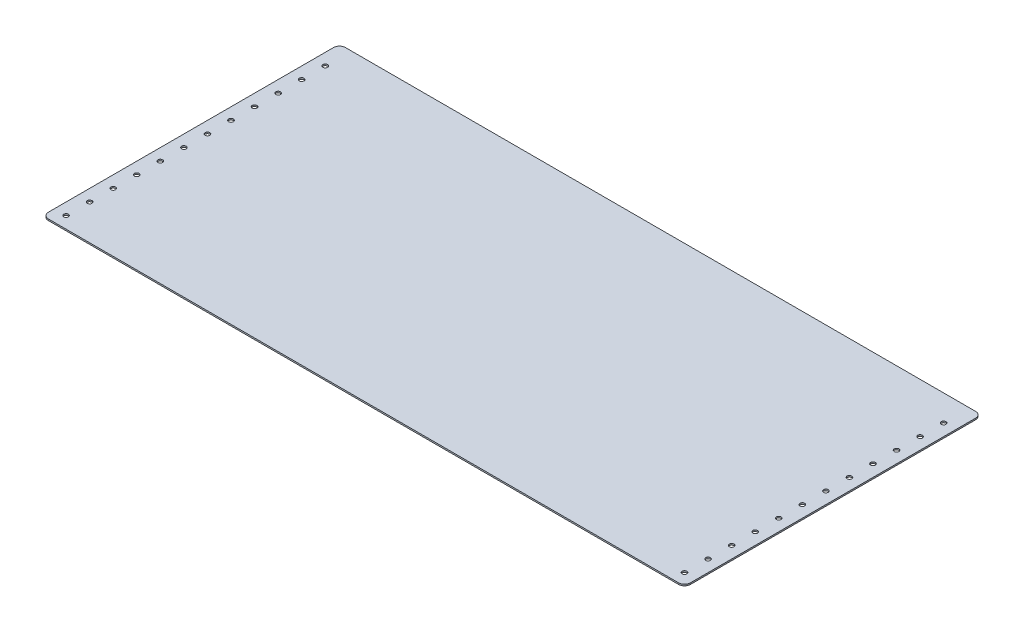
ISO-10303-21;
HEADER;
FILE_DESCRIPTION(('STEP AP214'),'2;1');
FILE_NAME('part.step','',(''),(''),'','','');
FILE_SCHEMA(('AUTOMOTIVE_DESIGN { 1 0 10303 214 1 1 1 1 }'));
ENDSEC;
DATA;
#1=APPLICATION_CONTEXT('core data for automotive mechanical design processes');
#2=APPLICATION_PROTOCOL_DEFINITION('international standard','automotive_design',2000,#1);
#3=PRODUCT_CONTEXT('',#1,'mechanical');
#4=PRODUCT('Part','Part','',(#3));
#5=PRODUCT_RELATED_PRODUCT_CATEGORY('part','',(#4));
#6=PRODUCT_DEFINITION_FORMATION('','',#4);
#7=PRODUCT_DEFINITION_CONTEXT('part definition',#1,'design');
#8=PRODUCT_DEFINITION('design','',#6,#7);
#9=PRODUCT_DEFINITION_SHAPE('','',#8);
#10=(LENGTH_UNIT() NAMED_UNIT(*) SI_UNIT(.MILLI.,.METRE.));
#11=(NAMED_UNIT(*) PLANE_ANGLE_UNIT() SI_UNIT($,.RADIAN.));
#12=(NAMED_UNIT(*) SI_UNIT($,.STERADIAN.) SOLID_ANGLE_UNIT());
#13=UNCERTAINTY_MEASURE_WITH_UNIT(LENGTH_MEASURE(1.E-05),#10,'distance_accuracy_value','');
#14=(GEOMETRIC_REPRESENTATION_CONTEXT(3) GLOBAL_UNCERTAINTY_ASSIGNED_CONTEXT((#13)) GLOBAL_UNIT_ASSIGNED_CONTEXT((#10,
#11,#12)) REPRESENTATION_CONTEXT('',''));
#15=CARTESIAN_POINT('',(0.,0.,0.));
#16=DIRECTION('',(0.,0.,1.));
#17=DIRECTION('',(1.,0.,0.));
#18=AXIS2_PLACEMENT_3D('',#15,#16,#17);
#19=CARTESIAN_POINT('',(0.,-639.7625,558.8));
#20=DIRECTION('',(0.,0.,-1.));
#21=DIRECTION('',(-1.,0.,0.));
#22=AXIS2_PLACEMENT_3D('',#19,#20,#21);
#23=PLANE('',#22);
#24=DIRECTION('',(1.,0.,0.));
#25=VECTOR('',#24,1.);
#26=CARTESIAN_POINT('',(0.,-639.7625,558.8));
#27=LINE('',#26,#25);
#28=CARTESIAN_POINT('',(-339.725,-639.7625,558.8));
#29=VERTEX_POINT('',#28);
#30=CARTESIAN_POINT('',(339.725,-639.7625,558.8));
#31=VERTEX_POINT('',#30);
#32=EDGE_CURVE('E140',#29,#31,#27,.T.);
#33=ORIENTED_EDGE('',*,*,#32,.F.);
#34=DIRECTION('',(0.,-1.,0.));
#35=VECTOR('',#34,1.);
#36=CARTESIAN_POINT('',(-339.725,-641.35,558.8));
#37=LINE('',#36,#35);
#38=CARTESIAN_POINT('',(-339.725,-641.35,558.8));
#39=VERTEX_POINT('',#38);
#40=EDGE_CURVE('E133',#29,#39,#37,.T.);
#41=ORIENTED_EDGE('',*,*,#40,.T.);
#42=DIRECTION('',(1.,0.,0.));
#43=VECTOR('',#42,1.);
#44=CARTESIAN_POINT('',(0.,-641.35,558.8));
#45=LINE('',#44,#43);
#46=CARTESIAN_POINT('',(339.725,-641.35,558.8));
#47=VERTEX_POINT('',#46);
#48=EDGE_CURVE('E139',#39,#47,#45,.T.);
#49=ORIENTED_EDGE('',*,*,#48,.T.);
#50=DIRECTION('',(0.,-1.,0.));
#51=VECTOR('',#50,1.);
#52=CARTESIAN_POINT('',(339.725,-639.7625,558.8));
#53=LINE('',#52,#51);
#54=EDGE_CURVE('E128',#47,#31,#53,.F.);
#55=ORIENTED_EDGE('',*,*,#54,.T.);
#56=EDGE_LOOP('',(#33,#41,#49,#55));
#57=FACE_BOUND('',#56,.T.);
#58=ADVANCED_FACE('F17',(#57),#23,.F.);
#59=CARTESIAN_POINT('',(-346.075,-639.7625,398.718559901171));
#60=DIRECTION('',(-1.,0.,0.));
#61=DIRECTION('',(0.,-1.,0.));
#62=AXIS2_PLACEMENT_3D('',#59,#60,#61);
#63=PLANE('',#62);
#64=DIRECTION('',(0.,0.,-1.));
#65=VECTOR('',#64,1.);
#66=CARTESIAN_POINT('',(-346.075,-641.35,398.718559901171));
#67=LINE('',#66,#65);
#68=CARTESIAN_POINT('',(-346.075,-641.35,552.45));
#69=VERTEX_POINT('',#68);
#70=CARTESIAN_POINT('',(-346.075,-641.35,244.987119802341));
#71=VERTEX_POINT('',#70);
#72=EDGE_CURVE('E91',#69,#71,#67,.T.);
#73=ORIENTED_EDGE('',*,*,#72,.F.);
#74=DIRECTION('',(0.,-1.,0.));
#75=VECTOR('',#74,1.);
#76=CARTESIAN_POINT('',(-346.075,-639.7625,552.45));
#77=LINE('',#76,#75);
#78=CARTESIAN_POINT('',(-346.075,-639.7625,552.45));
#79=VERTEX_POINT('',#78);
#80=EDGE_CURVE('E25',#69,#79,#77,.F.);
#81=ORIENTED_EDGE('',*,*,#80,.T.);
#82=DIRECTION('',(0.,0.,-1.));
#83=VECTOR('',#82,1.);
#84=CARTESIAN_POINT('',(-346.075,-639.7625,398.718559901171));
#85=LINE('',#84,#83);
#86=CARTESIAN_POINT('',(-346.075,-639.7625,244.987119802341));
#87=VERTEX_POINT('',#86);
#88=EDGE_CURVE('E220',#79,#87,#85,.T.);
#89=ORIENTED_EDGE('',*,*,#88,.T.);
#90=DIRECTION('',(0.,-1.,0.));
#91=VECTOR('',#90,1.);
#92=CARTESIAN_POINT('',(-346.075,-639.7625,244.987119802341));
#93=LINE('',#92,#91);
#94=EDGE_CURVE('E113',#87,#71,#93,.T.);
#95=ORIENTED_EDGE('',*,*,#94,.T.);
#96=EDGE_LOOP('',(#73,#81,#89,#95));
#97=FACE_BOUND('',#96,.T.);
#98=ADVANCED_FACE('F312',(#97),#63,.T.);
#99=CARTESIAN_POINT('',(0.,-639.7625,238.637119802341));
#100=DIRECTION('',(0.,0.,-1.));
#101=DIRECTION('',(-1.,0.,0.));
#102=AXIS2_PLACEMENT_3D('',#99,#100,#101);
#103=PLANE('',#102);
#104=DIRECTION('',(1.,0.,0.));
#105=VECTOR('',#104,1.);
#106=CARTESIAN_POINT('',(0.,-641.35,238.637119802341));
#107=LINE('',#106,#105);
#108=CARTESIAN_POINT('',(-339.725,-641.35,238.637119802341));
#109=VERTEX_POINT('',#108);
#110=CARTESIAN_POINT('',(339.725,-641.35,238.637119802341));
#111=VERTEX_POINT('',#110);
#112=EDGE_CURVE('E79',#109,#111,#107,.T.);
#113=ORIENTED_EDGE('',*,*,#112,.F.);
#114=DIRECTION('',(0.,-1.,0.));
#115=VECTOR('',#114,1.);
#116=CARTESIAN_POINT('',(-339.725,-639.7625,238.637119802341));
#117=LINE('',#116,#115);
#118=CARTESIAN_POINT('',(-339.725,-639.7625,238.637119802341));
#119=VERTEX_POINT('',#118);
#120=EDGE_CURVE('E117',#109,#119,#117,.F.);
#121=ORIENTED_EDGE('',*,*,#120,.T.);
#122=DIRECTION('',(1.,0.,0.));
#123=VECTOR('',#122,1.);
#124=CARTESIAN_POINT('',(0.,-639.7625,238.637119802341));
#125=LINE('',#124,#123);
#126=CARTESIAN_POINT('',(339.725,-639.7625,238.637119802341));
#127=VERTEX_POINT('',#126);
#128=EDGE_CURVE('E103',#119,#127,#125,.T.);
#129=ORIENTED_EDGE('',*,*,#128,.T.);
#130=DIRECTION('',(0.,-1.,0.));
#131=VECTOR('',#130,1.);
#132=CARTESIAN_POINT('',(339.725,-641.35,238.637119802341));
#133=LINE('',#132,#131);
#134=EDGE_CURVE('E97',#127,#111,#133,.T.);
#135=ORIENTED_EDGE('',*,*,#134,.T.);
#136=EDGE_LOOP('',(#113,#121,#129,#135));
#137=FACE_BOUND('',#136,.T.);
#138=ADVANCED_FACE('F101',(#137),#103,.T.);
#139=CARTESIAN_POINT('',(-333.375,-639.7625,546.1));
#140=DIRECTION('',(0.,-1.,0.));
#141=DIRECTION('',(1.,0.,0.));
#142=AXIS2_PLACEMENT_3D('',#139,#140,#141);
#143=CYLINDRICAL_SURFACE('',#142,2.5527);
#144=CARTESIAN_POINT('',(-333.375,-639.7625,546.1));
#145=DIRECTION('',(0.,-1.,0.));
#146=DIRECTION('',(1.,0.,0.));
#147=AXIS2_PLACEMENT_3D('',#144,#145,#146);
#148=CIRCLE('',#147,2.5527);
#149=CARTESIAN_POINT('',(-330.8223,-639.7625,546.1));
#150=VERTEX_POINT('',#149);
#151=EDGE_CURVE('E223',#150,#150,#148,.T.);
#152=ORIENTED_EDGE('',*,*,#151,.F.);
#153=EDGE_LOOP('',(#152));
#154=FACE_BOUND('',#153,.T.);
#155=CARTESIAN_POINT('',(-333.375,-641.35,546.1));
#156=DIRECTION('',(0.,-1.,0.));
#157=DIRECTION('',(1.,0.,0.));
#158=AXIS2_PLACEMENT_3D('',#155,#156,#157);
#159=CIRCLE('',#158,2.5527);
#160=CARTESIAN_POINT('',(-330.8223,-641.35,546.1));
#161=VERTEX_POINT('',#160);
#162=EDGE_CURVE('E144',#161,#161,#159,.T.);
#163=ORIENTED_EDGE('',*,*,#162,.T.);
#164=EDGE_LOOP('',(#163));
#165=FACE_BOUND('',#164,.T.);
#166=ADVANCED_FACE('F320',(#154,#165),#143,.F.);
#167=CARTESIAN_POINT('',(333.375,-639.7625,520.7));
#168=DIRECTION('',(0.,-1.,0.));
#169=DIRECTION('',(1.,0.,0.));
#170=AXIS2_PLACEMENT_3D('',#167,#168,#169);
#171=CYLINDRICAL_SURFACE('',#170,2.5527);
#172=CARTESIAN_POINT('',(333.375,-639.7625,520.7));
#173=DIRECTION('',(0.,1.,0.));
#174=DIRECTION('',(1.,0.,0.));
#175=AXIS2_PLACEMENT_3D('',#172,#173,#174);
#176=CIRCLE('',#175,2.5527);
#177=CARTESIAN_POINT('',(335.9277,-639.7625,520.7));
#178=VERTEX_POINT('',#177);
#179=EDGE_CURVE('E226',#178,#178,#176,.T.);
#180=ORIENTED_EDGE('',*,*,#179,.T.);
#181=EDGE_LOOP('',(#180));
#182=FACE_BOUND('',#181,.T.);
#183=CARTESIAN_POINT('',(333.375,-641.35,520.7));
#184=DIRECTION('',(0.,1.,0.));
#185=DIRECTION('',(1.,0.,0.));
#186=AXIS2_PLACEMENT_3D('',#183,#184,#185);
#187=CIRCLE('',#186,2.5527);
#188=CARTESIAN_POINT('',(335.9277,-641.35,520.7));
#189=VERTEX_POINT('',#188);
#190=EDGE_CURVE('E148',#189,#189,#187,.T.);
#191=ORIENTED_EDGE('',*,*,#190,.F.);
#192=EDGE_LOOP('',(#191));
#193=FACE_BOUND('',#192,.T.);
#194=ADVANCED_FACE('F323',(#182,#193),#171,.F.);
#195=CARTESIAN_POINT('',(-333.375,-639.7625,495.3));
#196=DIRECTION('',(0.,-1.,0.));
#197=DIRECTION('',(1.,0.,0.));
#198=AXIS2_PLACEMENT_3D('',#195,#196,#197);
#199=CYLINDRICAL_SURFACE('',#198,2.5527);
#200=CARTESIAN_POINT('',(-333.375,-639.7625,495.3));
#201=DIRECTION('',(0.,-1.,0.));
#202=DIRECTION('',(1.,0.,0.));
#203=AXIS2_PLACEMENT_3D('',#200,#201,#202);
#204=CIRCLE('',#203,2.5527);
#205=CARTESIAN_POINT('',(-330.8223,-639.7625,495.3));
#206=VERTEX_POINT('',#205);
#207=EDGE_CURVE('E229',#206,#206,#204,.T.);
#208=ORIENTED_EDGE('',*,*,#207,.F.);
#209=EDGE_LOOP('',(#208));
#210=FACE_BOUND('',#209,.T.);
#211=CARTESIAN_POINT('',(-333.375,-641.35,495.3));
#212=DIRECTION('',(0.,-1.,0.));
#213=DIRECTION('',(1.,0.,0.));
#214=AXIS2_PLACEMENT_3D('',#211,#212,#213);
#215=CIRCLE('',#214,2.5527);
#216=CARTESIAN_POINT('',(-330.8223,-641.35,495.3));
#217=VERTEX_POINT('',#216);
#218=EDGE_CURVE('E153',#217,#217,#215,.T.);
#219=ORIENTED_EDGE('',*,*,#218,.T.);
#220=EDGE_LOOP('',(#219));
#221=FACE_BOUND('',#220,.T.);
#222=ADVANCED_FACE('F327',(#210,#221),#199,.F.);
#223=CARTESIAN_POINT('',(333.375,-639.7625,469.9));
#224=DIRECTION('',(0.,-1.,0.));
#225=DIRECTION('',(1.,0.,0.));
#226=AXIS2_PLACEMENT_3D('',#223,#224,#225);
#227=CYLINDRICAL_SURFACE('',#226,2.5527);
#228=CARTESIAN_POINT('',(333.375,-639.7625,469.9));
#229=DIRECTION('',(0.,1.,0.));
#230=DIRECTION('',(1.,0.,0.));
#231=AXIS2_PLACEMENT_3D('',#228,#229,#230);
#232=CIRCLE('',#231,2.5527);
#233=CARTESIAN_POINT('',(335.9277,-639.7625,469.9));
#234=VERTEX_POINT('',#233);
#235=EDGE_CURVE('E232',#234,#234,#232,.T.);
#236=ORIENTED_EDGE('',*,*,#235,.T.);
#237=EDGE_LOOP('',(#236));
#238=FACE_BOUND('',#237,.T.);
#239=CARTESIAN_POINT('',(333.375,-641.35,469.9));
#240=DIRECTION('',(0.,1.,0.));
#241=DIRECTION('',(1.,0.,0.));
#242=AXIS2_PLACEMENT_3D('',#239,#240,#241);
#243=CIRCLE('',#242,2.5527);
#244=CARTESIAN_POINT('',(335.9277,-641.35,469.9));
#245=VERTEX_POINT('',#244);
#246=EDGE_CURVE('E156',#245,#245,#243,.T.);
#247=ORIENTED_EDGE('',*,*,#246,.F.);
#248=EDGE_LOOP('',(#247));
#249=FACE_BOUND('',#248,.T.);
#250=ADVANCED_FACE('F331',(#238,#249),#227,.F.);
#251=CARTESIAN_POINT('',(-333.375,-639.7625,444.5));
#252=DIRECTION('',(0.,-1.,0.));
#253=DIRECTION('',(1.,0.,0.));
#254=AXIS2_PLACEMENT_3D('',#251,#252,#253);
#255=CYLINDRICAL_SURFACE('',#254,2.5527);
#256=CARTESIAN_POINT('',(-333.375,-639.7625,444.5));
#257=DIRECTION('',(0.,-1.,0.));
#258=DIRECTION('',(1.,0.,0.));
#259=AXIS2_PLACEMENT_3D('',#256,#257,#258);
#260=CIRCLE('',#259,2.5527);
#261=CARTESIAN_POINT('',(-330.8223,-639.7625,444.5));
#262=VERTEX_POINT('',#261);
#263=EDGE_CURVE('E235',#262,#262,#260,.T.);
#264=ORIENTED_EDGE('',*,*,#263,.F.);
#265=EDGE_LOOP('',(#264));
#266=FACE_BOUND('',#265,.T.);
#267=CARTESIAN_POINT('',(-333.375,-641.35,444.5));
#268=DIRECTION('',(0.,-1.,0.));
#269=DIRECTION('',(1.,0.,0.));
#270=AXIS2_PLACEMENT_3D('',#267,#268,#269);
#271=CIRCLE('',#270,2.5527);
#272=CARTESIAN_POINT('',(-330.8223,-641.35,444.5));
#273=VERTEX_POINT('',#272);
#274=EDGE_CURVE('E159',#273,#273,#271,.T.);
#275=ORIENTED_EDGE('',*,*,#274,.T.);
#276=EDGE_LOOP('',(#275));
#277=FACE_BOUND('',#276,.T.);
#278=ADVANCED_FACE('F335',(#266,#277),#255,.F.);
#279=CARTESIAN_POINT('',(333.375,-639.7625,419.1));
#280=DIRECTION('',(0.,-1.,0.));
#281=DIRECTION('',(1.,0.,0.));
#282=AXIS2_PLACEMENT_3D('',#279,#280,#281);
#283=CYLINDRICAL_SURFACE('',#282,2.5527);
#284=CARTESIAN_POINT('',(333.375,-639.7625,419.1));
#285=DIRECTION('',(0.,1.,0.));
#286=DIRECTION('',(1.,0.,0.));
#287=AXIS2_PLACEMENT_3D('',#284,#285,#286);
#288=CIRCLE('',#287,2.5527);
#289=CARTESIAN_POINT('',(335.9277,-639.7625,419.1));
#290=VERTEX_POINT('',#289);
#291=EDGE_CURVE('E238',#290,#290,#288,.T.);
#292=ORIENTED_EDGE('',*,*,#291,.T.);
#293=EDGE_LOOP('',(#292));
#294=FACE_BOUND('',#293,.T.);
#295=CARTESIAN_POINT('',(333.375,-641.35,419.1));
#296=DIRECTION('',(0.,1.,0.));
#297=DIRECTION('',(1.,0.,0.));
#298=AXIS2_PLACEMENT_3D('',#295,#296,#297);
#299=CIRCLE('',#298,2.5527);
#300=CARTESIAN_POINT('',(335.9277,-641.35,419.1));
#301=VERTEX_POINT('',#300);
#302=EDGE_CURVE('E162',#301,#301,#299,.T.);
#303=ORIENTED_EDGE('',*,*,#302,.F.);
#304=EDGE_LOOP('',(#303));
#305=FACE_BOUND('',#304,.T.);
#306=ADVANCED_FACE('F339',(#294,#305),#283,.F.);
#307=CARTESIAN_POINT('',(-333.375,-639.7625,393.7));
#308=DIRECTION('',(0.,-1.,0.));
#309=DIRECTION('',(1.,0.,0.));
#310=AXIS2_PLACEMENT_3D('',#307,#308,#309);
#311=CYLINDRICAL_SURFACE('',#310,2.5527);
#312=CARTESIAN_POINT('',(-333.375,-639.7625,393.7));
#313=DIRECTION('',(0.,-1.,0.));
#314=DIRECTION('',(1.,0.,0.));
#315=AXIS2_PLACEMENT_3D('',#312,#313,#314);
#316=CIRCLE('',#315,2.5527);
#317=CARTESIAN_POINT('',(-330.8223,-639.7625,393.7));
#318=VERTEX_POINT('',#317);
#319=EDGE_CURVE('E241',#318,#318,#316,.T.);
#320=ORIENTED_EDGE('',*,*,#319,.F.);
#321=EDGE_LOOP('',(#320));
#322=FACE_BOUND('',#321,.T.);
#323=CARTESIAN_POINT('',(-333.375,-641.35,393.7));
#324=DIRECTION('',(0.,-1.,0.));
#325=DIRECTION('',(1.,0.,0.));
#326=AXIS2_PLACEMENT_3D('',#323,#324,#325);
#327=CIRCLE('',#326,2.5527);
#328=CARTESIAN_POINT('',(-330.8223,-641.35,393.7));
#329=VERTEX_POINT('',#328);
#330=EDGE_CURVE('E165',#329,#329,#327,.T.);
#331=ORIENTED_EDGE('',*,*,#330,.T.);
#332=EDGE_LOOP('',(#331));
#333=FACE_BOUND('',#332,.T.);
#334=ADVANCED_FACE('F343',(#322,#333),#311,.F.);
#335=CARTESIAN_POINT('',(333.375,-639.7625,368.3));
#336=DIRECTION('',(0.,-1.,0.));
#337=DIRECTION('',(1.,0.,0.));
#338=AXIS2_PLACEMENT_3D('',#335,#336,#337);
#339=CYLINDRICAL_SURFACE('',#338,2.5527);
#340=CARTESIAN_POINT('',(333.375,-639.7625,368.3));
#341=DIRECTION('',(0.,1.,0.));
#342=DIRECTION('',(1.,0.,0.));
#343=AXIS2_PLACEMENT_3D('',#340,#341,#342);
#344=CIRCLE('',#343,2.5527);
#345=CARTESIAN_POINT('',(335.9277,-639.7625,368.3));
#346=VERTEX_POINT('',#345);
#347=EDGE_CURVE('E244',#346,#346,#344,.T.);
#348=ORIENTED_EDGE('',*,*,#347,.T.);
#349=EDGE_LOOP('',(#348));
#350=FACE_BOUND('',#349,.T.);
#351=CARTESIAN_POINT('',(333.375,-641.35,368.3));
#352=DIRECTION('',(0.,1.,0.));
#353=DIRECTION('',(1.,0.,0.));
#354=AXIS2_PLACEMENT_3D('',#351,#352,#353);
#355=CIRCLE('',#354,2.5527);
#356=CARTESIAN_POINT('',(335.9277,-641.35,368.3));
#357=VERTEX_POINT('',#356);
#358=EDGE_CURVE('E168',#357,#357,#355,.T.);
#359=ORIENTED_EDGE('',*,*,#358,.F.);
#360=EDGE_LOOP('',(#359));
#361=FACE_BOUND('',#360,.T.);
#362=ADVANCED_FACE('F347',(#350,#361),#339,.F.);
#363=CARTESIAN_POINT('',(-333.375,-639.7625,342.9));
#364=DIRECTION('',(0.,-1.,0.));
#365=DIRECTION('',(1.,0.,0.));
#366=AXIS2_PLACEMENT_3D('',#363,#364,#365);
#367=CYLINDRICAL_SURFACE('',#366,2.5527);
#368=CARTESIAN_POINT('',(-333.375,-639.7625,342.9));
#369=DIRECTION('',(0.,-1.,0.));
#370=DIRECTION('',(1.,0.,0.));
#371=AXIS2_PLACEMENT_3D('',#368,#369,#370);
#372=CIRCLE('',#371,2.5527);
#373=CARTESIAN_POINT('',(-330.8223,-639.7625,342.9));
#374=VERTEX_POINT('',#373);
#375=EDGE_CURVE('E247',#374,#374,#372,.T.);
#376=ORIENTED_EDGE('',*,*,#375,.F.);
#377=EDGE_LOOP('',(#376));
#378=FACE_BOUND('',#377,.T.);
#379=CARTESIAN_POINT('',(-333.375,-641.35,342.9));
#380=DIRECTION('',(0.,-1.,0.));
#381=DIRECTION('',(1.,0.,0.));
#382=AXIS2_PLACEMENT_3D('',#379,#380,#381);
#383=CIRCLE('',#382,2.5527);
#384=CARTESIAN_POINT('',(-330.8223,-641.35,342.9));
#385=VERTEX_POINT('',#384);
#386=EDGE_CURVE('E171',#385,#385,#383,.T.);
#387=ORIENTED_EDGE('',*,*,#386,.T.);
#388=EDGE_LOOP('',(#387));
#389=FACE_BOUND('',#388,.T.);
#390=ADVANCED_FACE('F351',(#378,#389),#367,.F.);
#391=CARTESIAN_POINT('',(333.375,-639.7625,317.5));
#392=DIRECTION('',(0.,-1.,0.));
#393=DIRECTION('',(1.,0.,0.));
#394=AXIS2_PLACEMENT_3D('',#391,#392,#393);
#395=CYLINDRICAL_SURFACE('',#394,2.5527);
#396=CARTESIAN_POINT('',(333.375,-639.7625,317.5));
#397=DIRECTION('',(0.,1.,0.));
#398=DIRECTION('',(1.,0.,0.));
#399=AXIS2_PLACEMENT_3D('',#396,#397,#398);
#400=CIRCLE('',#399,2.5527);
#401=CARTESIAN_POINT('',(335.9277,-639.7625,317.5));
#402=VERTEX_POINT('',#401);
#403=EDGE_CURVE('E250',#402,#402,#400,.T.);
#404=ORIENTED_EDGE('',*,*,#403,.T.);
#405=EDGE_LOOP('',(#404));
#406=FACE_BOUND('',#405,.T.);
#407=CARTESIAN_POINT('',(333.375,-641.35,317.5));
#408=DIRECTION('',(0.,1.,0.));
#409=DIRECTION('',(1.,0.,0.));
#410=AXIS2_PLACEMENT_3D('',#407,#408,#409);
#411=CIRCLE('',#410,2.5527);
#412=CARTESIAN_POINT('',(335.9277,-641.35,317.5));
#413=VERTEX_POINT('',#412);
#414=EDGE_CURVE('E174',#413,#413,#411,.T.);
#415=ORIENTED_EDGE('',*,*,#414,.F.);
#416=EDGE_LOOP('',(#415));
#417=FACE_BOUND('',#416,.T.);
#418=ADVANCED_FACE('F355',(#406,#417),#395,.F.);
#419=CARTESIAN_POINT('',(-333.375,-639.7625,292.1));
#420=DIRECTION('',(0.,-1.,0.));
#421=DIRECTION('',(1.,0.,0.));
#422=AXIS2_PLACEMENT_3D('',#419,#420,#421);
#423=CYLINDRICAL_SURFACE('',#422,2.5527);
#424=CARTESIAN_POINT('',(-333.375,-639.7625,292.1));
#425=DIRECTION('',(0.,-1.,0.));
#426=DIRECTION('',(1.,0.,0.));
#427=AXIS2_PLACEMENT_3D('',#424,#425,#426);
#428=CIRCLE('',#427,2.5527);
#429=CARTESIAN_POINT('',(-330.8223,-639.7625,292.1));
#430=VERTEX_POINT('',#429);
#431=EDGE_CURVE('E253',#430,#430,#428,.T.);
#432=ORIENTED_EDGE('',*,*,#431,.F.);
#433=EDGE_LOOP('',(#432));
#434=FACE_BOUND('',#433,.T.);
#435=CARTESIAN_POINT('',(-333.375,-641.35,292.1));
#436=DIRECTION('',(0.,-1.,0.));
#437=DIRECTION('',(1.,0.,0.));
#438=AXIS2_PLACEMENT_3D('',#435,#436,#437);
#439=CIRCLE('',#438,2.5527);
#440=CARTESIAN_POINT('',(-330.8223,-641.35,292.1));
#441=VERTEX_POINT('',#440);
#442=EDGE_CURVE('E177',#441,#441,#439,.T.);
#443=ORIENTED_EDGE('',*,*,#442,.T.);
#444=EDGE_LOOP('',(#443));
#445=FACE_BOUND('',#444,.T.);
#446=ADVANCED_FACE('F359',(#434,#445),#423,.F.);
#447=CARTESIAN_POINT('',(333.375,-639.7625,266.7));
#448=DIRECTION('',(0.,-1.,0.));
#449=DIRECTION('',(1.,0.,0.));
#450=AXIS2_PLACEMENT_3D('',#447,#448,#449);
#451=CYLINDRICAL_SURFACE('',#450,2.5527);
#452=CARTESIAN_POINT('',(333.375,-639.7625,266.7));
#453=DIRECTION('',(0.,1.,0.));
#454=DIRECTION('',(1.,0.,0.));
#455=AXIS2_PLACEMENT_3D('',#452,#453,#454);
#456=CIRCLE('',#455,2.5527);
#457=CARTESIAN_POINT('',(335.9277,-639.7625,266.7));
#458=VERTEX_POINT('',#457);
#459=EDGE_CURVE('E256',#458,#458,#456,.T.);
#460=ORIENTED_EDGE('',*,*,#459,.T.);
#461=EDGE_LOOP('',(#460));
#462=FACE_BOUND('',#461,.T.);
#463=CARTESIAN_POINT('',(333.375,-641.35,266.7));
#464=DIRECTION('',(0.,1.,0.));
#465=DIRECTION('',(1.,0.,0.));
#466=AXIS2_PLACEMENT_3D('',#463,#464,#465);
#467=CIRCLE('',#466,2.5527);
#468=CARTESIAN_POINT('',(335.9277,-641.35,266.7));
#469=VERTEX_POINT('',#468);
#470=EDGE_CURVE('E180',#469,#469,#467,.T.);
#471=ORIENTED_EDGE('',*,*,#470,.F.);
#472=EDGE_LOOP('',(#471));
#473=FACE_BOUND('',#472,.T.);
#474=ADVANCED_FACE('F363',(#462,#473),#451,.F.);
#475=CARTESIAN_POINT('',(-333.375,-639.7625,266.7));
#476=DIRECTION('',(0.,-1.,0.));
#477=DIRECTION('',(1.,0.,0.));
#478=AXIS2_PLACEMENT_3D('',#475,#476,#477);
#479=CYLINDRICAL_SURFACE('',#478,2.5527);
#480=CARTESIAN_POINT('',(-333.375,-639.7625,266.7));
#481=DIRECTION('',(0.,-1.,0.));
#482=DIRECTION('',(1.,0.,0.));
#483=AXIS2_PLACEMENT_3D('',#480,#481,#482);
#484=CIRCLE('',#483,2.5527);
#485=CARTESIAN_POINT('',(-330.8223,-639.7625,266.7));
#486=VERTEX_POINT('',#485);
#487=EDGE_CURVE('E259',#486,#486,#484,.T.);
#488=ORIENTED_EDGE('',*,*,#487,.F.);
#489=EDGE_LOOP('',(#488));
#490=FACE_BOUND('',#489,.T.);
#491=CARTESIAN_POINT('',(-333.375,-641.35,266.7));
#492=DIRECTION('',(0.,-1.,0.));
#493=DIRECTION('',(1.,0.,0.));
#494=AXIS2_PLACEMENT_3D('',#491,#492,#493);
#495=CIRCLE('',#494,2.5527);
#496=CARTESIAN_POINT('',(-330.8223,-641.35,266.7));
#497=VERTEX_POINT('',#496);
#498=EDGE_CURVE('E183',#497,#497,#495,.T.);
#499=ORIENTED_EDGE('',*,*,#498,.T.);
#500=EDGE_LOOP('',(#499));
#501=FACE_BOUND('',#500,.T.);
#502=ADVANCED_FACE('F367',(#490,#501),#479,.F.);
#503=CARTESIAN_POINT('',(333.375,-639.7625,292.1));
#504=DIRECTION('',(0.,-1.,0.));
#505=DIRECTION('',(1.,0.,0.));
#506=AXIS2_PLACEMENT_3D('',#503,#504,#505);
#507=CYLINDRICAL_SURFACE('',#506,2.5527);
#508=CARTESIAN_POINT('',(333.375,-639.7625,292.1));
#509=DIRECTION('',(0.,1.,0.));
#510=DIRECTION('',(1.,0.,0.));
#511=AXIS2_PLACEMENT_3D('',#508,#509,#510);
#512=CIRCLE('',#511,2.5527);
#513=CARTESIAN_POINT('',(335.9277,-639.7625,292.1));
#514=VERTEX_POINT('',#513);
#515=EDGE_CURVE('E262',#514,#514,#512,.T.);
#516=ORIENTED_EDGE('',*,*,#515,.T.);
#517=EDGE_LOOP('',(#516));
#518=FACE_BOUND('',#517,.T.);
#519=CARTESIAN_POINT('',(333.375,-641.35,292.1));
#520=DIRECTION('',(0.,1.,0.));
#521=DIRECTION('',(1.,0.,0.));
#522=AXIS2_PLACEMENT_3D('',#519,#520,#521);
#523=CIRCLE('',#522,2.5527);
#524=CARTESIAN_POINT('',(335.9277,-641.35,292.1));
#525=VERTEX_POINT('',#524);
#526=EDGE_CURVE('E186',#525,#525,#523,.T.);
#527=ORIENTED_EDGE('',*,*,#526,.F.);
#528=EDGE_LOOP('',(#527));
#529=FACE_BOUND('',#528,.T.);
#530=ADVANCED_FACE('F371',(#518,#529),#507,.F.);
#531=CARTESIAN_POINT('',(-333.375,-639.7625,317.5));
#532=DIRECTION('',(0.,-1.,0.));
#533=DIRECTION('',(1.,0.,0.));
#534=AXIS2_PLACEMENT_3D('',#531,#532,#533);
#535=CYLINDRICAL_SURFACE('',#534,2.5527);
#536=CARTESIAN_POINT('',(-333.375,-639.7625,317.5));
#537=DIRECTION('',(0.,-1.,0.));
#538=DIRECTION('',(1.,0.,0.));
#539=AXIS2_PLACEMENT_3D('',#536,#537,#538);
#540=CIRCLE('',#539,2.5527);
#541=CARTESIAN_POINT('',(-330.8223,-639.7625,317.5));
#542=VERTEX_POINT('',#541);
#543=EDGE_CURVE('E265',#542,#542,#540,.T.);
#544=ORIENTED_EDGE('',*,*,#543,.F.);
#545=EDGE_LOOP('',(#544));
#546=FACE_BOUND('',#545,.T.);
#547=CARTESIAN_POINT('',(-333.375,-641.35,317.5));
#548=DIRECTION('',(0.,-1.,0.));
#549=DIRECTION('',(1.,0.,0.));
#550=AXIS2_PLACEMENT_3D('',#547,#548,#549);
#551=CIRCLE('',#550,2.5527);
#552=CARTESIAN_POINT('',(-330.8223,-641.35,317.5));
#553=VERTEX_POINT('',#552);
#554=EDGE_CURVE('E189',#553,#553,#551,.T.);
#555=ORIENTED_EDGE('',*,*,#554,.T.);
#556=EDGE_LOOP('',(#555));
#557=FACE_BOUND('',#556,.T.);
#558=ADVANCED_FACE('F375',(#546,#557),#535,.F.);
#559=CARTESIAN_POINT('',(333.375,-639.7625,342.9));
#560=DIRECTION('',(0.,-1.,0.));
#561=DIRECTION('',(1.,0.,0.));
#562=AXIS2_PLACEMENT_3D('',#559,#560,#561);
#563=CYLINDRICAL_SURFACE('',#562,2.5527);
#564=CARTESIAN_POINT('',(333.375,-639.7625,342.9));
#565=DIRECTION('',(0.,1.,0.));
#566=DIRECTION('',(1.,0.,0.));
#567=AXIS2_PLACEMENT_3D('',#564,#565,#566);
#568=CIRCLE('',#567,2.5527);
#569=CARTESIAN_POINT('',(335.9277,-639.7625,342.9));
#570=VERTEX_POINT('',#569);
#571=EDGE_CURVE('E268',#570,#570,#568,.T.);
#572=ORIENTED_EDGE('',*,*,#571,.T.);
#573=EDGE_LOOP('',(#572));
#574=FACE_BOUND('',#573,.T.);
#575=CARTESIAN_POINT('',(333.375,-641.35,342.9));
#576=DIRECTION('',(0.,1.,0.));
#577=DIRECTION('',(1.,0.,0.));
#578=AXIS2_PLACEMENT_3D('',#575,#576,#577);
#579=CIRCLE('',#578,2.5527);
#580=CARTESIAN_POINT('',(335.9277,-641.35,342.9));
#581=VERTEX_POINT('',#580);
#582=EDGE_CURVE('E192',#581,#581,#579,.T.);
#583=ORIENTED_EDGE('',*,*,#582,.F.);
#584=EDGE_LOOP('',(#583));
#585=FACE_BOUND('',#584,.T.);
#586=ADVANCED_FACE('F379',(#574,#585),#563,.F.);
#587=CARTESIAN_POINT('',(-333.375,-639.7625,368.3));
#588=DIRECTION('',(0.,-1.,0.));
#589=DIRECTION('',(1.,0.,0.));
#590=AXIS2_PLACEMENT_3D('',#587,#588,#589);
#591=CYLINDRICAL_SURFACE('',#590,2.5527);
#592=CARTESIAN_POINT('',(-333.375,-639.7625,368.3));
#593=DIRECTION('',(0.,-1.,0.));
#594=DIRECTION('',(1.,0.,0.));
#595=AXIS2_PLACEMENT_3D('',#592,#593,#594);
#596=CIRCLE('',#595,2.5527);
#597=CARTESIAN_POINT('',(-330.8223,-639.7625,368.3));
#598=VERTEX_POINT('',#597);
#599=EDGE_CURVE('E271',#598,#598,#596,.T.);
#600=ORIENTED_EDGE('',*,*,#599,.F.);
#601=EDGE_LOOP('',(#600));
#602=FACE_BOUND('',#601,.T.);
#603=CARTESIAN_POINT('',(-333.375,-641.35,368.3));
#604=DIRECTION('',(0.,-1.,0.));
#605=DIRECTION('',(1.,0.,0.));
#606=AXIS2_PLACEMENT_3D('',#603,#604,#605);
#607=CIRCLE('',#606,2.5527);
#608=CARTESIAN_POINT('',(-330.8223,-641.35,368.3));
#609=VERTEX_POINT('',#608);
#610=EDGE_CURVE('E195',#609,#609,#607,.T.);
#611=ORIENTED_EDGE('',*,*,#610,.T.);
#612=EDGE_LOOP('',(#611));
#613=FACE_BOUND('',#612,.T.);
#614=ADVANCED_FACE('F383',(#602,#613),#591,.F.);
#615=CARTESIAN_POINT('',(333.375,-639.7625,393.7));
#616=DIRECTION('',(0.,-1.,0.));
#617=DIRECTION('',(1.,0.,0.));
#618=AXIS2_PLACEMENT_3D('',#615,#616,#617);
#619=CYLINDRICAL_SURFACE('',#618,2.5527);
#620=CARTESIAN_POINT('',(333.375,-639.7625,393.7));
#621=DIRECTION('',(0.,1.,0.));
#622=DIRECTION('',(1.,0.,0.));
#623=AXIS2_PLACEMENT_3D('',#620,#621,#622);
#624=CIRCLE('',#623,2.5527);
#625=CARTESIAN_POINT('',(335.9277,-639.7625,393.7));
#626=VERTEX_POINT('',#625);
#627=EDGE_CURVE('E274',#626,#626,#624,.T.);
#628=ORIENTED_EDGE('',*,*,#627,.T.);
#629=EDGE_LOOP('',(#628));
#630=FACE_BOUND('',#629,.T.);
#631=CARTESIAN_POINT('',(333.375,-641.35,393.7));
#632=DIRECTION('',(0.,1.,0.));
#633=DIRECTION('',(1.,0.,0.));
#634=AXIS2_PLACEMENT_3D('',#631,#632,#633);
#635=CIRCLE('',#634,2.5527);
#636=CARTESIAN_POINT('',(335.9277,-641.35,393.7));
#637=VERTEX_POINT('',#636);
#638=EDGE_CURVE('E198',#637,#637,#635,.T.);
#639=ORIENTED_EDGE('',*,*,#638,.F.);
#640=EDGE_LOOP('',(#639));
#641=FACE_BOUND('',#640,.T.);
#642=ADVANCED_FACE('F387',(#630,#641),#619,.F.);
#643=CARTESIAN_POINT('',(-333.375,-639.7625,419.1));
#644=DIRECTION('',(0.,-1.,0.));
#645=DIRECTION('',(1.,0.,0.));
#646=AXIS2_PLACEMENT_3D('',#643,#644,#645);
#647=CYLINDRICAL_SURFACE('',#646,2.5527);
#648=CARTESIAN_POINT('',(-333.375,-639.7625,419.1));
#649=DIRECTION('',(0.,-1.,0.));
#650=DIRECTION('',(1.,0.,0.));
#651=AXIS2_PLACEMENT_3D('',#648,#649,#650);
#652=CIRCLE('',#651,2.5527);
#653=CARTESIAN_POINT('',(-330.8223,-639.7625,419.1));
#654=VERTEX_POINT('',#653);
#655=EDGE_CURVE('E277',#654,#654,#652,.T.);
#656=ORIENTED_EDGE('',*,*,#655,.F.);
#657=EDGE_LOOP('',(#656));
#658=FACE_BOUND('',#657,.T.);
#659=CARTESIAN_POINT('',(-333.375,-641.35,419.1));
#660=DIRECTION('',(0.,-1.,0.));
#661=DIRECTION('',(1.,0.,0.));
#662=AXIS2_PLACEMENT_3D('',#659,#660,#661);
#663=CIRCLE('',#662,2.5527);
#664=CARTESIAN_POINT('',(-330.8223,-641.35,419.1));
#665=VERTEX_POINT('',#664);
#666=EDGE_CURVE('E201',#665,#665,#663,.T.);
#667=ORIENTED_EDGE('',*,*,#666,.T.);
#668=EDGE_LOOP('',(#667));
#669=FACE_BOUND('',#668,.T.);
#670=ADVANCED_FACE('F391',(#658,#669),#647,.F.);
#671=CARTESIAN_POINT('',(333.375,-639.7625,444.5));
#672=DIRECTION('',(0.,-1.,0.));
#673=DIRECTION('',(1.,0.,0.));
#674=AXIS2_PLACEMENT_3D('',#671,#672,#673);
#675=CYLINDRICAL_SURFACE('',#674,2.5527);
#676=CARTESIAN_POINT('',(333.375,-639.7625,444.5));
#677=DIRECTION('',(0.,1.,0.));
#678=DIRECTION('',(1.,0.,0.));
#679=AXIS2_PLACEMENT_3D('',#676,#677,#678);
#680=CIRCLE('',#679,2.5527);
#681=CARTESIAN_POINT('',(335.9277,-639.7625,444.5));
#682=VERTEX_POINT('',#681);
#683=EDGE_CURVE('E280',#682,#682,#680,.T.);
#684=ORIENTED_EDGE('',*,*,#683,.T.);
#685=EDGE_LOOP('',(#684));
#686=FACE_BOUND('',#685,.T.);
#687=CARTESIAN_POINT('',(333.375,-641.35,444.5));
#688=DIRECTION('',(0.,1.,0.));
#689=DIRECTION('',(1.,0.,0.));
#690=AXIS2_PLACEMENT_3D('',#687,#688,#689);
#691=CIRCLE('',#690,2.5527);
#692=CARTESIAN_POINT('',(335.9277,-641.35,444.5));
#693=VERTEX_POINT('',#692);
#694=EDGE_CURVE('E204',#693,#693,#691,.T.);
#695=ORIENTED_EDGE('',*,*,#694,.F.);
#696=EDGE_LOOP('',(#695));
#697=FACE_BOUND('',#696,.T.);
#698=ADVANCED_FACE('F395',(#686,#697),#675,.F.);
#699=CARTESIAN_POINT('',(-333.375,-639.7625,469.9));
#700=DIRECTION('',(0.,-1.,0.));
#701=DIRECTION('',(1.,0.,0.));
#702=AXIS2_PLACEMENT_3D('',#699,#700,#701);
#703=CYLINDRICAL_SURFACE('',#702,2.5527);
#704=CARTESIAN_POINT('',(-333.375,-639.7625,469.9));
#705=DIRECTION('',(0.,-1.,0.));
#706=DIRECTION('',(1.,0.,0.));
#707=AXIS2_PLACEMENT_3D('',#704,#705,#706);
#708=CIRCLE('',#707,2.5527);
#709=CARTESIAN_POINT('',(-330.8223,-639.7625,469.9));
#710=VERTEX_POINT('',#709);
#711=EDGE_CURVE('E283',#710,#710,#708,.T.);
#712=ORIENTED_EDGE('',*,*,#711,.F.);
#713=EDGE_LOOP('',(#712));
#714=FACE_BOUND('',#713,.T.);
#715=CARTESIAN_POINT('',(-333.375,-641.35,469.9));
#716=DIRECTION('',(0.,-1.,0.));
#717=DIRECTION('',(1.,0.,0.));
#718=AXIS2_PLACEMENT_3D('',#715,#716,#717);
#719=CIRCLE('',#718,2.5527);
#720=CARTESIAN_POINT('',(-330.8223,-641.35,469.9));
#721=VERTEX_POINT('',#720);
#722=EDGE_CURVE('E207',#721,#721,#719,.T.);
#723=ORIENTED_EDGE('',*,*,#722,.T.);
#724=EDGE_LOOP('',(#723));
#725=FACE_BOUND('',#724,.T.);
#726=ADVANCED_FACE('F399',(#714,#725),#703,.F.);
#727=CARTESIAN_POINT('',(333.375,-639.7625,495.3));
#728=DIRECTION('',(0.,-1.,0.));
#729=DIRECTION('',(1.,0.,0.));
#730=AXIS2_PLACEMENT_3D('',#727,#728,#729);
#731=CYLINDRICAL_SURFACE('',#730,2.5527);
#732=CARTESIAN_POINT('',(333.375,-639.7625,495.3));
#733=DIRECTION('',(0.,1.,0.));
#734=DIRECTION('',(1.,0.,0.));
#735=AXIS2_PLACEMENT_3D('',#732,#733,#734);
#736=CIRCLE('',#735,2.5527);
#737=CARTESIAN_POINT('',(335.9277,-639.7625,495.3));
#738=VERTEX_POINT('',#737);
#739=EDGE_CURVE('E286',#738,#738,#736,.T.);
#740=ORIENTED_EDGE('',*,*,#739,.T.);
#741=EDGE_LOOP('',(#740));
#742=FACE_BOUND('',#741,.T.);
#743=CARTESIAN_POINT('',(333.375,-641.35,495.3));
#744=DIRECTION('',(0.,1.,0.));
#745=DIRECTION('',(1.,0.,0.));
#746=AXIS2_PLACEMENT_3D('',#743,#744,#745);
#747=CIRCLE('',#746,2.5527);
#748=CARTESIAN_POINT('',(335.9277,-641.35,495.3));
#749=VERTEX_POINT('',#748);
#750=EDGE_CURVE('E210',#749,#749,#747,.T.);
#751=ORIENTED_EDGE('',*,*,#750,.F.);
#752=EDGE_LOOP('',(#751));
#753=FACE_BOUND('',#752,.T.);
#754=ADVANCED_FACE('F403',(#742,#753),#731,.F.);
#755=CARTESIAN_POINT('',(-333.375,-639.7625,520.7));
#756=DIRECTION('',(0.,-1.,0.));
#757=DIRECTION('',(1.,0.,0.));
#758=AXIS2_PLACEMENT_3D('',#755,#756,#757);
#759=CYLINDRICAL_SURFACE('',#758,2.5527);
#760=CARTESIAN_POINT('',(-333.375,-639.7625,520.7));
#761=DIRECTION('',(0.,-1.,0.));
#762=DIRECTION('',(1.,0.,0.));
#763=AXIS2_PLACEMENT_3D('',#760,#761,#762);
#764=CIRCLE('',#763,2.5527);
#765=CARTESIAN_POINT('',(-330.8223,-639.7625,520.7));
#766=VERTEX_POINT('',#765);
#767=EDGE_CURVE('E289',#766,#766,#764,.T.);
#768=ORIENTED_EDGE('',*,*,#767,.F.);
#769=EDGE_LOOP('',(#768));
#770=FACE_BOUND('',#769,.T.);
#771=CARTESIAN_POINT('',(-333.375,-641.35,520.7));
#772=DIRECTION('',(0.,-1.,0.));
#773=DIRECTION('',(1.,0.,0.));
#774=AXIS2_PLACEMENT_3D('',#771,#772,#773);
#775=CIRCLE('',#774,2.5527);
#776=CARTESIAN_POINT('',(-330.8223,-641.35,520.7));
#777=VERTEX_POINT('',#776);
#778=EDGE_CURVE('E213',#777,#777,#775,.T.);
#779=ORIENTED_EDGE('',*,*,#778,.T.);
#780=EDGE_LOOP('',(#779));
#781=FACE_BOUND('',#780,.T.);
#782=ADVANCED_FACE('F407',(#770,#781),#759,.F.);
#783=CARTESIAN_POINT('',(333.375,-639.7625,546.1));
#784=DIRECTION('',(0.,-1.,0.));
#785=DIRECTION('',(1.,0.,0.));
#786=AXIS2_PLACEMENT_3D('',#783,#784,#785);
#787=CYLINDRICAL_SURFACE('',#786,2.5527);
#788=CARTESIAN_POINT('',(333.375,-639.7625,546.1));
#789=DIRECTION('',(0.,1.,0.));
#790=DIRECTION('',(1.,0.,0.));
#791=AXIS2_PLACEMENT_3D('',#788,#789,#790);
#792=CIRCLE('',#791,2.5527);
#793=CARTESIAN_POINT('',(335.9277,-639.7625,546.1));
#794=VERTEX_POINT('',#793);
#795=EDGE_CURVE('E292',#794,#794,#792,.T.);
#796=ORIENTED_EDGE('',*,*,#795,.T.);
#797=EDGE_LOOP('',(#796));
#798=FACE_BOUND('',#797,.T.);
#799=CARTESIAN_POINT('',(333.375,-641.35,546.1));
#800=DIRECTION('',(0.,1.,0.));
#801=DIRECTION('',(1.,0.,0.));
#802=AXIS2_PLACEMENT_3D('',#799,#800,#801);
#803=CIRCLE('',#802,2.5527);
#804=CARTESIAN_POINT('',(335.9277,-641.35,546.1));
#805=VERTEX_POINT('',#804);
#806=EDGE_CURVE('E216',#805,#805,#803,.T.);
#807=ORIENTED_EDGE('',*,*,#806,.F.);
#808=EDGE_LOOP('',(#807));
#809=FACE_BOUND('',#808,.T.);
#810=ADVANCED_FACE('F411',(#798,#809),#787,.F.);
#811=CARTESIAN_POINT('',(346.075,-639.7625,398.718559901171));
#812=DIRECTION('',(-1.,0.,0.));
#813=DIRECTION('',(0.,-1.,0.));
#814=AXIS2_PLACEMENT_3D('',#811,#812,#813);
#815=PLANE('',#814);
#816=DIRECTION('',(0.,0.,-1.));
#817=VECTOR('',#816,1.);
#818=CARTESIAN_POINT('',(346.075,-639.7625,398.718559901171));
#819=LINE('',#818,#817);
#820=CARTESIAN_POINT('',(346.075,-639.7625,552.45));
#821=VERTEX_POINT('',#820);
#822=CARTESIAN_POINT('',(346.075,-639.7625,244.987119802341));
#823=VERTEX_POINT('',#822);
#824=EDGE_CURVE('E105',#821,#823,#819,.T.);
#825=ORIENTED_EDGE('',*,*,#824,.F.);
#826=DIRECTION('',(0.,-1.,0.));
#827=VECTOR('',#826,1.);
#828=CARTESIAN_POINT('',(346.075,-639.7625,552.45));
#829=LINE('',#828,#827);
#830=CARTESIAN_POINT('',(346.075,-641.35,552.45));
#831=VERTEX_POINT('',#830);
#832=EDGE_CURVE('E122',#821,#831,#829,.T.);
#833=ORIENTED_EDGE('',*,*,#832,.T.);
#834=DIRECTION('',(0.,0.,-1.));
#835=VECTOR('',#834,1.);
#836=CARTESIAN_POINT('',(346.075,-641.35,398.718559901171));
#837=LINE('',#836,#835);
#838=CARTESIAN_POINT('',(346.075,-641.35,244.987119802341));
#839=VERTEX_POINT('',#838);
#840=EDGE_CURVE('E90',#831,#839,#837,.T.);
#841=ORIENTED_EDGE('',*,*,#840,.T.);
#842=DIRECTION('',(0.,-1.,0.));
#843=VECTOR('',#842,1.);
#844=CARTESIAN_POINT('',(346.075,-639.7625,244.987119802341));
#845=LINE('',#844,#843);
#846=EDGE_CURVE('E99',#839,#823,#845,.F.);
#847=ORIENTED_EDGE('',*,*,#846,.T.);
#848=EDGE_LOOP('',(#825,#833,#841,#847));
#849=FACE_BOUND('',#848,.T.);
#850=ADVANCED_FACE('F298',(#849),#815,.F.);
#851=CARTESIAN_POINT('',(-0.79375,-639.7625,389.193559901171));
#852=DIRECTION('',(0.,-1.,0.));
#853=DIRECTION('',(1.,0.,0.));
#854=AXIS2_PLACEMENT_3D('',#851,#852,#853);
#855=PLANE('',#854);
#856=ORIENTED_EDGE('',*,*,#795,.F.);
#857=EDGE_LOOP('',(#856));
#858=FACE_BOUND('',#857,.T.);
#859=ORIENTED_EDGE('',*,*,#767,.T.);
#860=EDGE_LOOP('',(#859));
#861=FACE_BOUND('',#860,.T.);
#862=ORIENTED_EDGE('',*,*,#739,.F.);
#863=EDGE_LOOP('',(#862));
#864=FACE_BOUND('',#863,.T.);
#865=ORIENTED_EDGE('',*,*,#711,.T.);
#866=EDGE_LOOP('',(#865));
#867=FACE_BOUND('',#866,.T.);
#868=ORIENTED_EDGE('',*,*,#683,.F.);
#869=EDGE_LOOP('',(#868));
#870=FACE_BOUND('',#869,.T.);
#871=ORIENTED_EDGE('',*,*,#655,.T.);
#872=EDGE_LOOP('',(#871));
#873=FACE_BOUND('',#872,.T.);
#874=ORIENTED_EDGE('',*,*,#627,.F.);
#875=EDGE_LOOP('',(#874));
#876=FACE_BOUND('',#875,.T.);
#877=ORIENTED_EDGE('',*,*,#599,.T.);
#878=EDGE_LOOP('',(#877));
#879=FACE_BOUND('',#878,.T.);
#880=ORIENTED_EDGE('',*,*,#571,.F.);
#881=EDGE_LOOP('',(#880));
#882=FACE_BOUND('',#881,.T.);
#883=ORIENTED_EDGE('',*,*,#543,.T.);
#884=EDGE_LOOP('',(#883));
#885=FACE_BOUND('',#884,.T.);
#886=ORIENTED_EDGE('',*,*,#515,.F.);
#887=EDGE_LOOP('',(#886));
#888=FACE_BOUND('',#887,.T.);
#889=ORIENTED_EDGE('',*,*,#487,.T.);
#890=EDGE_LOOP('',(#889));
#891=FACE_BOUND('',#890,.T.);
#892=ORIENTED_EDGE('',*,*,#459,.F.);
#893=EDGE_LOOP('',(#892));
#894=FACE_BOUND('',#893,.T.);
#895=ORIENTED_EDGE('',*,*,#431,.T.);
#896=EDGE_LOOP('',(#895));
#897=FACE_BOUND('',#896,.T.);
#898=ORIENTED_EDGE('',*,*,#403,.F.);
#899=EDGE_LOOP('',(#898));
#900=FACE_BOUND('',#899,.T.);
#901=ORIENTED_EDGE('',*,*,#375,.T.);
#902=EDGE_LOOP('',(#901));
#903=FACE_BOUND('',#902,.T.);
#904=ORIENTED_EDGE('',*,*,#347,.F.);
#905=EDGE_LOOP('',(#904));
#906=FACE_BOUND('',#905,.T.);
#907=ORIENTED_EDGE('',*,*,#319,.T.);
#908=EDGE_LOOP('',(#907));
#909=FACE_BOUND('',#908,.T.);
#910=ORIENTED_EDGE('',*,*,#291,.F.);
#911=EDGE_LOOP('',(#910));
#912=FACE_BOUND('',#911,.T.);
#913=ORIENTED_EDGE('',*,*,#263,.T.);
#914=EDGE_LOOP('',(#913));
#915=FACE_BOUND('',#914,.T.);
#916=ORIENTED_EDGE('',*,*,#235,.F.);
#917=EDGE_LOOP('',(#916));
#918=FACE_BOUND('',#917,.T.);
#919=ORIENTED_EDGE('',*,*,#207,.T.);
#920=EDGE_LOOP('',(#919));
#921=FACE_BOUND('',#920,.T.);
#922=ORIENTED_EDGE('',*,*,#179,.F.);
#923=EDGE_LOOP('',(#922));
#924=FACE_BOUND('',#923,.T.);
#925=ORIENTED_EDGE('',*,*,#151,.T.);
#926=EDGE_LOOP('',(#925));
#927=FACE_BOUND('',#926,.T.);
#928=ORIENTED_EDGE('',*,*,#88,.F.);
#929=CARTESIAN_POINT('',(-339.725,-639.7625,552.45));
#930=DIRECTION('',(0.,-1.,0.));
#931=DIRECTION('',(1.,0.,0.));
#932=AXIS2_PLACEMENT_3D('',#929,#930,#931);
#933=CIRCLE('',#932,6.35);
#934=EDGE_CURVE('E11',#79,#29,#933,.F.);
#935=ORIENTED_EDGE('',*,*,#934,.T.);
#936=ORIENTED_EDGE('',*,*,#32,.T.);
#937=CARTESIAN_POINT('',(339.725,-639.7625,552.45));
#938=DIRECTION('',(0.,-1.,0.));
#939=DIRECTION('',(1.,0.,0.));
#940=AXIS2_PLACEMENT_3D('',#937,#938,#939);
#941=CIRCLE('',#940,6.35);
#942=EDGE_CURVE('E131',#31,#821,#941,.F.);
#943=ORIENTED_EDGE('',*,*,#942,.T.);
#944=ORIENTED_EDGE('',*,*,#824,.T.);
#945=CARTESIAN_POINT('',(339.725,-639.7625,244.987119802341));
#946=DIRECTION('',(0.,-1.,0.));
#947=DIRECTION('',(1.,0.,0.));
#948=AXIS2_PLACEMENT_3D('',#945,#946,#947);
#949=CIRCLE('',#948,6.35);
#950=EDGE_CURVE('E111',#823,#127,#949,.F.);
#951=ORIENTED_EDGE('',*,*,#950,.T.);
#952=ORIENTED_EDGE('',*,*,#128,.F.);
#953=CARTESIAN_POINT('',(-339.725,-639.7625,244.987119802341));
#954=DIRECTION('',(0.,-1.,0.));
#955=DIRECTION('',(1.,0.,0.));
#956=AXIS2_PLACEMENT_3D('',#953,#954,#955);
#957=CIRCLE('',#956,6.35);
#958=EDGE_CURVE('E119',#119,#87,#957,.F.);
#959=ORIENTED_EDGE('',*,*,#958,.T.);
#960=EDGE_LOOP('',(#928,#935,#936,#943,#944,#951,#952,#959));
#961=FACE_BOUND('',#960,.T.);
#962=ADVANCED_FACE('F304',(#858,#861,#864,#867,#870,#873,#876,#879,#882,#885,#888,#891,#894,
#897,#900,#903,#906,#909,#912,#915,#918,#921,#924,#927,#961),#855,.F.);
#963=CARTESIAN_POINT('',(-0.79375,-641.35,389.193559901171));
#964=DIRECTION('',(0.,-1.,0.));
#965=DIRECTION('',(1.,0.,0.));
#966=AXIS2_PLACEMENT_3D('',#963,#964,#965);
#967=PLANE('',#966);
#968=ORIENTED_EDGE('',*,*,#806,.T.);
#969=EDGE_LOOP('',(#968));
#970=FACE_BOUND('',#969,.T.);
#971=ORIENTED_EDGE('',*,*,#778,.F.);
#972=EDGE_LOOP('',(#971));
#973=FACE_BOUND('',#972,.T.);
#974=ORIENTED_EDGE('',*,*,#750,.T.);
#975=EDGE_LOOP('',(#974));
#976=FACE_BOUND('',#975,.T.);
#977=ORIENTED_EDGE('',*,*,#722,.F.);
#978=EDGE_LOOP('',(#977));
#979=FACE_BOUND('',#978,.T.);
#980=ORIENTED_EDGE('',*,*,#694,.T.);
#981=EDGE_LOOP('',(#980));
#982=FACE_BOUND('',#981,.T.);
#983=ORIENTED_EDGE('',*,*,#666,.F.);
#984=EDGE_LOOP('',(#983));
#985=FACE_BOUND('',#984,.T.);
#986=ORIENTED_EDGE('',*,*,#638,.T.);
#987=EDGE_LOOP('',(#986));
#988=FACE_BOUND('',#987,.T.);
#989=ORIENTED_EDGE('',*,*,#610,.F.);
#990=EDGE_LOOP('',(#989));
#991=FACE_BOUND('',#990,.T.);
#992=ORIENTED_EDGE('',*,*,#582,.T.);
#993=EDGE_LOOP('',(#992));
#994=FACE_BOUND('',#993,.T.);
#995=ORIENTED_EDGE('',*,*,#554,.F.);
#996=EDGE_LOOP('',(#995));
#997=FACE_BOUND('',#996,.T.);
#998=ORIENTED_EDGE('',*,*,#526,.T.);
#999=EDGE_LOOP('',(#998));
#1000=FACE_BOUND('',#999,.T.);
#1001=ORIENTED_EDGE('',*,*,#498,.F.);
#1002=EDGE_LOOP('',(#1001));
#1003=FACE_BOUND('',#1002,.T.);
#1004=ORIENTED_EDGE('',*,*,#470,.T.);
#1005=EDGE_LOOP('',(#1004));
#1006=FACE_BOUND('',#1005,.T.);
#1007=ORIENTED_EDGE('',*,*,#442,.F.);
#1008=EDGE_LOOP('',(#1007));
#1009=FACE_BOUND('',#1008,.T.);
#1010=ORIENTED_EDGE('',*,*,#414,.T.);
#1011=EDGE_LOOP('',(#1010));
#1012=FACE_BOUND('',#1011,.T.);
#1013=ORIENTED_EDGE('',*,*,#386,.F.);
#1014=EDGE_LOOP('',(#1013));
#1015=FACE_BOUND('',#1014,.T.);
#1016=ORIENTED_EDGE('',*,*,#358,.T.);
#1017=EDGE_LOOP('',(#1016));
#1018=FACE_BOUND('',#1017,.T.);
#1019=ORIENTED_EDGE('',*,*,#330,.F.);
#1020=EDGE_LOOP('',(#1019));
#1021=FACE_BOUND('',#1020,.T.);
#1022=ORIENTED_EDGE('',*,*,#302,.T.);
#1023=EDGE_LOOP('',(#1022));
#1024=FACE_BOUND('',#1023,.T.);
#1025=ORIENTED_EDGE('',*,*,#274,.F.);
#1026=EDGE_LOOP('',(#1025));
#1027=FACE_BOUND('',#1026,.T.);
#1028=ORIENTED_EDGE('',*,*,#246,.T.);
#1029=EDGE_LOOP('',(#1028));
#1030=FACE_BOUND('',#1029,.T.);
#1031=ORIENTED_EDGE('',*,*,#218,.F.);
#1032=EDGE_LOOP('',(#1031));
#1033=FACE_BOUND('',#1032,.T.);
#1034=ORIENTED_EDGE('',*,*,#190,.T.);
#1035=EDGE_LOOP('',(#1034));
#1036=FACE_BOUND('',#1035,.T.);
#1037=ORIENTED_EDGE('',*,*,#162,.F.);
#1038=EDGE_LOOP('',(#1037));
#1039=FACE_BOUND('',#1038,.T.);
#1040=ORIENTED_EDGE('',*,*,#48,.F.);
#1041=CARTESIAN_POINT('',(-339.725,-641.35,552.45));
#1042=DIRECTION('',(0.,-1.,0.));
#1043=DIRECTION('',(1.,0.,0.));
#1044=AXIS2_PLACEMENT_3D('',#1041,#1042,#1043);
#1045=CIRCLE('',#1044,6.35);
#1046=EDGE_CURVE('E39',#39,#69,#1045,.T.);
#1047=ORIENTED_EDGE('',*,*,#1046,.T.);
#1048=ORIENTED_EDGE('',*,*,#72,.T.);
#1049=CARTESIAN_POINT('',(-339.725,-641.35,244.987119802341));
#1050=DIRECTION('',(0.,-1.,0.));
#1051=DIRECTION('',(1.,0.,0.));
#1052=AXIS2_PLACEMENT_3D('',#1049,#1050,#1051);
#1053=CIRCLE('',#1052,6.35);
#1054=EDGE_CURVE('E86',#71,#109,#1053,.T.);
#1055=ORIENTED_EDGE('',*,*,#1054,.T.);
#1056=ORIENTED_EDGE('',*,*,#112,.T.);
#1057=CARTESIAN_POINT('',(339.725,-641.35,244.987119802341));
#1058=DIRECTION('',(0.,-1.,0.));
#1059=DIRECTION('',(1.,0.,0.));
#1060=AXIS2_PLACEMENT_3D('',#1057,#1058,#1059);
#1061=CIRCLE('',#1060,6.35);
#1062=EDGE_CURVE('E83',#111,#839,#1061,.T.);
#1063=ORIENTED_EDGE('',*,*,#1062,.T.);
#1064=ORIENTED_EDGE('',*,*,#840,.F.);
#1065=CARTESIAN_POINT('',(339.725,-641.35,552.45));
#1066=DIRECTION('',(0.,-1.,0.));
#1067=DIRECTION('',(1.,0.,0.));
#1068=AXIS2_PLACEMENT_3D('',#1065,#1066,#1067);
#1069=CIRCLE('',#1068,6.35);
#1070=EDGE_CURVE('E125',#831,#47,#1069,.T.);
#1071=ORIENTED_EDGE('',*,*,#1070,.T.);
#1072=EDGE_LOOP('',(#1040,#1047,#1048,#1055,#1056,#1063,#1064,#1071));
#1073=FACE_BOUND('',#1072,.T.);
#1074=ADVANCED_FACE('F81',(#970,#973,#976,#979,#982,#985,#988,#991,#994,#997,#1000,#1003,#1006,
#1009,#1012,#1015,#1018,#1021,#1024,#1027,#1030,#1033,#1036,#1039,#1073),#967,.T.);
#1075=CARTESIAN_POINT('',(339.725,-639.7625,244.987119802341));
#1076=DIRECTION('',(0.,1.,0.));
#1077=DIRECTION('',(-1.,0.,0.));
#1078=AXIS2_PLACEMENT_3D('',#1075,#1076,#1077);
#1079=CYLINDRICAL_SURFACE('',#1078,6.35);
#1080=ORIENTED_EDGE('',*,*,#950,.F.);
#1081=ORIENTED_EDGE('',*,*,#846,.F.);
#1082=ORIENTED_EDGE('',*,*,#1062,.F.);
#1083=ORIENTED_EDGE('',*,*,#134,.F.);
#1084=EDGE_LOOP('',(#1080,#1081,#1082,#1083));
#1085=FACE_BOUND('',#1084,.T.);
#1086=ADVANCED_FACE('F96',(#1085),#1079,.T.);
#1087=CARTESIAN_POINT('',(-339.725,-639.7625,244.987119802341));
#1088=DIRECTION('',(0.,-1.,0.));
#1089=DIRECTION('',(1.,0.,0.));
#1090=AXIS2_PLACEMENT_3D('',#1087,#1088,#1089);
#1091=CYLINDRICAL_SURFACE('',#1090,6.35);
#1092=ORIENTED_EDGE('',*,*,#958,.F.);
#1093=ORIENTED_EDGE('',*,*,#120,.F.);
#1094=ORIENTED_EDGE('',*,*,#1054,.F.);
#1095=ORIENTED_EDGE('',*,*,#94,.F.);
#1096=EDGE_LOOP('',(#1092,#1093,#1094,#1095));
#1097=FACE_BOUND('',#1096,.T.);
#1098=ADVANCED_FACE('F310',(#1097),#1091,.T.);
#1099=CARTESIAN_POINT('',(339.725,-639.7625,552.45));
#1100=DIRECTION('',(0.,-1.,0.));
#1101=DIRECTION('',(1.,0.,0.));
#1102=AXIS2_PLACEMENT_3D('',#1099,#1100,#1101);
#1103=CYLINDRICAL_SURFACE('',#1102,6.35);
#1104=ORIENTED_EDGE('',*,*,#942,.F.);
#1105=ORIENTED_EDGE('',*,*,#54,.F.);
#1106=ORIENTED_EDGE('',*,*,#1070,.F.);
#1107=ORIENTED_EDGE('',*,*,#832,.F.);
#1108=EDGE_LOOP('',(#1104,#1105,#1106,#1107));
#1109=FACE_BOUND('',#1108,.T.);
#1110=ADVANCED_FACE('F302',(#1109),#1103,.T.);
#1111=CARTESIAN_POINT('',(-339.725,-639.7625,552.45));
#1112=DIRECTION('',(0.,1.,0.));
#1113=DIRECTION('',(-1.,0.,0.));
#1114=AXIS2_PLACEMENT_3D('',#1111,#1112,#1113);
#1115=CYLINDRICAL_SURFACE('',#1114,6.35);
#1116=ORIENTED_EDGE('',*,*,#934,.F.);
#1117=ORIENTED_EDGE('',*,*,#80,.F.);
#1118=ORIENTED_EDGE('',*,*,#1046,.F.);
#1119=ORIENTED_EDGE('',*,*,#40,.F.);
#1120=EDGE_LOOP('',(#1116,#1117,#1118,#1119));
#1121=FACE_BOUND('',#1120,.T.);
#1122=ADVANCED_FACE('F19',(#1121),#1115,.T.);
#1123=CLOSED_SHELL('',(#58,#98,#138,#166,#194,#222,#250,#278,#306,#334,#362,#390,#418,#446,#474,
#502,#530,#558,#586,#614,#642,#670,#698,#726,#754,#782,#810,#850,#962,#1074,#1086,#1098,#1110,#1122));
#1124=MANIFOLD_SOLID_BREP('B1',#1123);
#1125=ADVANCED_BREP_SHAPE_REPRESENTATION('',(#18,#1124),#14);
#1126=SHAPE_DEFINITION_REPRESENTATION(#9,#1125);
ENDSEC;
END-ISO-10303-21;
